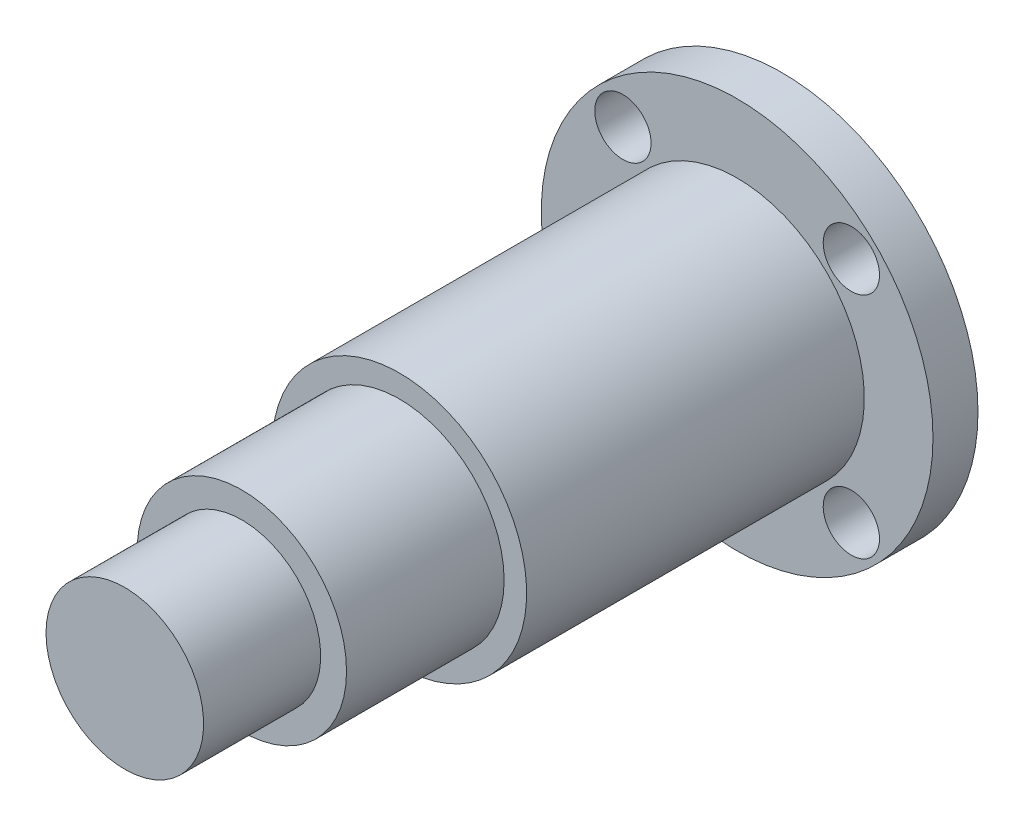
ISO-10303-21;
HEADER;
FILE_DESCRIPTION(('STEP AP214'),'2;1');
FILE_NAME('part.step','',(''),(''),'','','');
FILE_SCHEMA(('AUTOMOTIVE_DESIGN { 1 0 10303 214 1 1 1 1 }'));
ENDSEC;
DATA;
#1=APPLICATION_CONTEXT('core data for automotive mechanical design processes');
#2=APPLICATION_PROTOCOL_DEFINITION('international standard','automotive_design',2000,#1);
#3=PRODUCT_CONTEXT('',#1,'mechanical');
#4=PRODUCT('Part','Part','',(#3));
#5=PRODUCT_RELATED_PRODUCT_CATEGORY('part','',(#4));
#6=PRODUCT_DEFINITION_FORMATION('','',#4);
#7=PRODUCT_DEFINITION_CONTEXT('part definition',#1,'design');
#8=PRODUCT_DEFINITION('design','',#6,#7);
#9=PRODUCT_DEFINITION_SHAPE('','',#8);
#10=(LENGTH_UNIT() NAMED_UNIT(*) SI_UNIT(.MILLI.,.METRE.));
#11=(NAMED_UNIT(*) PLANE_ANGLE_UNIT() SI_UNIT($,.RADIAN.));
#12=(NAMED_UNIT(*) SI_UNIT($,.STERADIAN.) SOLID_ANGLE_UNIT());
#13=UNCERTAINTY_MEASURE_WITH_UNIT(LENGTH_MEASURE(1.E-05),#10,'distance_accuracy_value','');
#14=(GEOMETRIC_REPRESENTATION_CONTEXT(3) GLOBAL_UNCERTAINTY_ASSIGNED_CONTEXT((#13)) GLOBAL_UNIT_ASSIGNED_CONTEXT((#10,
#11,#12)) REPRESENTATION_CONTEXT('',''));
#15=CARTESIAN_POINT('',(0.,0.,0.));
#16=DIRECTION('',(0.,0.,1.));
#17=DIRECTION('',(1.,0.,0.));
#18=AXIS2_PLACEMENT_3D('',#15,#16,#17);
#19=CARTESIAN_POINT('',(0.,0.,5.08));
#20=DIRECTION('',(0.,0.,-1.));
#21=DIRECTION('',(-1.,0.,0.));
#22=AXIS2_PLACEMENT_3D('',#19,#20,#21);
#23=CYLINDRICAL_SURFACE('',#22,22.098);
#24=CARTESIAN_POINT('',(0.,0.,5.08));
#25=DIRECTION('',(0.,0.,1.));
#26=DIRECTION('',(1.,0.,0.));
#27=AXIS2_PLACEMENT_3D('',#24,#25,#26);
#28=CIRCLE('',#27,22.098);
#29=CARTESIAN_POINT('',(22.098,0.,5.08));
#30=VERTEX_POINT('',#29);
#31=EDGE_CURVE('E73',#30,#30,#28,.T.);
#32=ORIENTED_EDGE('',*,*,#31,.F.);
#33=EDGE_LOOP('',(#32));
#34=FACE_BOUND('',#33,.T.);
#35=CARTESIAN_POINT('',(0.,0.,0.));
#36=DIRECTION('',(0.,0.,1.));
#37=DIRECTION('',(1.,0.,0.));
#38=AXIS2_PLACEMENT_3D('',#35,#36,#37);
#39=CIRCLE('',#38,22.098);
#40=CARTESIAN_POINT('',(22.098,0.,0.));
#41=VERTEX_POINT('',#40);
#42=EDGE_CURVE('E46',#41,#41,#39,.T.);
#43=ORIENTED_EDGE('',*,*,#42,.T.);
#44=EDGE_LOOP('',(#43));
#45=FACE_BOUND('',#44,.T.);
#46=ADVANCED_FACE('F43',(#34,#45),#23,.T.);
#47=CARTESIAN_POINT('',(0.,0.,5.08));
#48=DIRECTION('',(0.,0.,1.));
#49=DIRECTION('',(1.,0.,0.));
#50=AXIS2_PLACEMENT_3D('',#47,#48,#49);
#51=PLANE('',#50);
#52=CARTESIAN_POINT('',(-12.8866675337343,12.8866675337342,5.08));
#53=DIRECTION('',(0.,0.,1.));
#54=DIRECTION('',(1.,0.,0.));
#55=AXIS2_PLACEMENT_3D('',#52,#53,#54);
#56=CIRCLE('',#55,3.175);
#57=CARTESIAN_POINT('',(-9.71166753373426,12.8866675337342,5.08));
#58=VERTEX_POINT('',#57);
#59=EDGE_CURVE('E216',#58,#58,#56,.F.);
#60=ORIENTED_EDGE('',*,*,#59,.T.);
#61=EDGE_LOOP('',(#60));
#62=FACE_BOUND('',#61,.T.);
#63=CARTESIAN_POINT('',(-12.8866675337343,-12.8866675337342,5.08));
#64=DIRECTION('',(0.,0.,1.));
#65=DIRECTION('',(1.,0.,0.));
#66=AXIS2_PLACEMENT_3D('',#63,#64,#65);
#67=CIRCLE('',#66,3.175);
#68=CARTESIAN_POINT('',(-9.71166753373426,-12.8866675337342,5.08));
#69=VERTEX_POINT('',#68);
#70=EDGE_CURVE('E225',#69,#69,#67,.F.);
#71=ORIENTED_EDGE('',*,*,#70,.T.);
#72=EDGE_LOOP('',(#71));
#73=FACE_BOUND('',#72,.T.);
#74=CARTESIAN_POINT('',(12.8866675337343,-12.8866675337341,5.08));
#75=DIRECTION('',(0.,0.,1.));
#76=DIRECTION('',(1.,0.,0.));
#77=AXIS2_PLACEMENT_3D('',#74,#75,#76);
#78=CIRCLE('',#77,3.175);
#79=CARTESIAN_POINT('',(16.0616675337343,-12.8866675337341,5.08));
#80=VERTEX_POINT('',#79);
#81=EDGE_CURVE('E232',#80,#80,#78,.F.);
#82=ORIENTED_EDGE('',*,*,#81,.T.);
#83=EDGE_LOOP('',(#82));
#84=FACE_BOUND('',#83,.T.);
#85=CARTESIAN_POINT('',(12.8866675337343,12.8866675337342,5.08));
#86=DIRECTION('',(0.,0.,1.));
#87=DIRECTION('',(1.,0.,0.));
#88=AXIS2_PLACEMENT_3D('',#85,#86,#87);
#89=CIRCLE('',#88,3.175);
#90=CARTESIAN_POINT('',(16.0616675337343,12.8866675337342,5.08));
#91=VERTEX_POINT('',#90);
#92=EDGE_CURVE('E223',#91,#91,#89,.F.);
#93=ORIENTED_EDGE('',*,*,#92,.T.);
#94=EDGE_LOOP('',(#93));
#95=FACE_BOUND('',#94,.T.);
#96=CARTESIAN_POINT('',(0.,0.,5.08));
#97=DIRECTION('',(0.,0.,1.));
#98=DIRECTION('',(1.,0.,0.));
#99=AXIS2_PLACEMENT_3D('',#96,#97,#98);
#100=CIRCLE('',#99,14.351);
#101=CARTESIAN_POINT('',(-14.351,0.,5.08));
#102=VERTEX_POINT('',#101);
#103=EDGE_CURVE('E57',#102,#102,#100,.T.);
#104=ORIENTED_EDGE('',*,*,#103,.F.);
#105=EDGE_LOOP('',(#104));
#106=FACE_BOUND('',#105,.T.);
#107=ORIENTED_EDGE('',*,*,#31,.T.);
#108=EDGE_LOOP('',(#107));
#109=FACE_BOUND('',#108,.T.);
#110=ADVANCED_FACE('F86',(#62,#73,#84,#95,#106,#109),#51,.T.);
#111=CARTESIAN_POINT('',(0.,0.,0.));
#112=DIRECTION('',(0.,0.,1.));
#113=DIRECTION('',(1.,0.,0.));
#114=AXIS2_PLACEMENT_3D('',#111,#112,#113);
#115=PLANE('',#114);
#116=CARTESIAN_POINT('',(-12.8866675337343,12.8866675337342,0.));
#117=DIRECTION('',(0.,0.,-1.));
#118=DIRECTION('',(0.,-1.,0.));
#119=AXIS2_PLACEMENT_3D('',#116,#117,#118);
#120=CIRCLE('',#119,3.175);
#121=CARTESIAN_POINT('',(-12.8866675337342,9.71166753373421,0.));
#122=VERTEX_POINT('',#121);
#123=EDGE_CURVE('E213',#122,#122,#120,.T.);
#124=ORIENTED_EDGE('',*,*,#123,.F.);
#125=EDGE_LOOP('',(#124));
#126=FACE_BOUND('',#125,.T.);
#127=CARTESIAN_POINT('',(-12.8866675337343,-12.8866675337342,0.));
#128=DIRECTION('',(0.,0.,-1.));
#129=DIRECTION('',(1.,0.,0.));
#130=AXIS2_PLACEMENT_3D('',#127,#128,#129);
#131=CIRCLE('',#130,3.175);
#132=CARTESIAN_POINT('',(-9.71166753373426,-12.8866675337342,0.));
#133=VERTEX_POINT('',#132);
#134=EDGE_CURVE('E228',#133,#133,#131,.T.);
#135=ORIENTED_EDGE('',*,*,#134,.F.);
#136=EDGE_LOOP('',(#135));
#137=FACE_BOUND('',#136,.T.);
#138=CARTESIAN_POINT('',(12.8866675337343,-12.8866675337341,0.));
#139=DIRECTION('',(0.,0.,-1.));
#140=DIRECTION('',(0.,1.,0.));
#141=AXIS2_PLACEMENT_3D('',#138,#139,#140);
#142=CIRCLE('',#141,3.175);
#143=CARTESIAN_POINT('',(12.8866675337343,-9.71166753373412,0.));
#144=VERTEX_POINT('',#143);
#145=EDGE_CURVE('E236',#144,#144,#142,.T.);
#146=ORIENTED_EDGE('',*,*,#145,.F.);
#147=EDGE_LOOP('',(#146));
#148=FACE_BOUND('',#147,.T.);
#149=CARTESIAN_POINT('',(12.8866675337343,12.8866675337342,0.));
#150=DIRECTION('',(0.,0.,-1.));
#151=DIRECTION('',(-1.,0.,0.));
#152=AXIS2_PLACEMENT_3D('',#149,#150,#151);
#153=CIRCLE('',#152,3.175);
#154=CARTESIAN_POINT('',(9.71166753373426,12.8866675337342,0.));
#155=VERTEX_POINT('',#154);
#156=EDGE_CURVE('E218',#155,#155,#153,.T.);
#157=ORIENTED_EDGE('',*,*,#156,.F.);
#158=EDGE_LOOP('',(#157));
#159=FACE_BOUND('',#158,.T.);
#160=ORIENTED_EDGE('',*,*,#42,.F.);
#161=EDGE_LOOP('',(#160));
#162=FACE_BOUND('',#161,.T.);
#163=ADVANCED_FACE('F83',(#126,#137,#148,#159,#162),#115,.F.);
#164=CARTESIAN_POINT('',(0.,0.,43.18));
#165=DIRECTION('',(0.,0.,-1.));
#166=DIRECTION('',(-1.,0.,0.));
#167=AXIS2_PLACEMENT_3D('',#164,#165,#166);
#168=CYLINDRICAL_SURFACE('',#167,14.351);
#169=CARTESIAN_POINT('',(0.,0.,43.18));
#170=DIRECTION('',(0.,0.,1.));
#171=DIRECTION('',(1.,0.,0.));
#172=AXIS2_PLACEMENT_3D('',#169,#170,#171);
#173=CIRCLE('',#172,14.351);
#174=CARTESIAN_POINT('',(-14.351,0.,43.18));
#175=VERTEX_POINT('',#174);
#176=EDGE_CURVE('E66',#175,#175,#173,.T.);
#177=CARTESIAN_POINT('',(-14.351,0.,43.18));
#178=CARTESIAN_POINT('',(-14.351,0.,42.783125));
#179=CARTESIAN_POINT('',(-14.351,0.,42.38625));
#180=CARTESIAN_POINT('',(-14.351,0.,41.5925));
#181=CARTESIAN_POINT('',(-14.351,0.,41.195625));
#182=CARTESIAN_POINT('',(-14.351,0.,40.401875));
#183=CARTESIAN_POINT('',(-14.351,0.,40.005));
#184=CARTESIAN_POINT('',(-14.351,0.,39.21125));
#185=CARTESIAN_POINT('',(-14.351,0.,38.814375));
#186=CARTESIAN_POINT('',(-14.351,0.,38.020625));
#187=CARTESIAN_POINT('',(-14.351,0.,37.62375));
#188=CARTESIAN_POINT('',(-14.351,0.,36.83));
#189=CARTESIAN_POINT('',(-14.351,0.,36.433125));
#190=CARTESIAN_POINT('',(-14.351,0.,35.639375));
#191=CARTESIAN_POINT('',(-14.351,0.,35.2425));
#192=CARTESIAN_POINT('',(-14.351,0.,34.44875));
#193=CARTESIAN_POINT('',(-14.351,0.,34.051875));
#194=CARTESIAN_POINT('',(-14.351,0.,33.258125));
#195=CARTESIAN_POINT('',(-14.351,0.,32.86125));
#196=CARTESIAN_POINT('',(-14.351,0.,32.0675));
#197=CARTESIAN_POINT('',(-14.351,0.,31.670625));
#198=CARTESIAN_POINT('',(-14.351,0.,30.876875));
#199=CARTESIAN_POINT('',(-14.351,0.,30.48));
#200=CARTESIAN_POINT('',(-14.351,0.,29.68625));
#201=CARTESIAN_POINT('',(-14.351,0.,29.289375));
#202=CARTESIAN_POINT('',(-14.351,0.,28.495625));
#203=CARTESIAN_POINT('',(-14.351,0.,28.09875));
#204=CARTESIAN_POINT('',(-14.351,0.,27.305));
#205=CARTESIAN_POINT('',(-14.351,0.,26.908125));
#206=CARTESIAN_POINT('',(-14.351,0.,26.114375));
#207=CARTESIAN_POINT('',(-14.351,0.,25.7175));
#208=CARTESIAN_POINT('',(-14.351,0.,24.92375));
#209=CARTESIAN_POINT('',(-14.351,0.,24.526875));
#210=CARTESIAN_POINT('',(-14.351,0.,23.733125));
#211=CARTESIAN_POINT('',(-14.351,0.,23.33625));
#212=CARTESIAN_POINT('',(-14.351,0.,22.5425));
#213=CARTESIAN_POINT('',(-14.351,0.,22.145625));
#214=CARTESIAN_POINT('',(-14.351,0.,21.351875));
#215=CARTESIAN_POINT('',(-14.351,0.,20.955));
#216=CARTESIAN_POINT('',(-14.351,0.,20.16125));
#217=CARTESIAN_POINT('',(-14.351,0.,19.764375));
#218=CARTESIAN_POINT('',(-14.351,0.,18.970625));
#219=CARTESIAN_POINT('',(-14.351,0.,18.57375));
#220=CARTESIAN_POINT('',(-14.351,0.,17.78));
#221=CARTESIAN_POINT('',(-14.351,0.,17.383125));
#222=CARTESIAN_POINT('',(-14.351,0.,16.589375));
#223=CARTESIAN_POINT('',(-14.351,0.,16.1925));
#224=CARTESIAN_POINT('',(-14.351,0.,15.39875));
#225=CARTESIAN_POINT('',(-14.351,0.,15.001875));
#226=CARTESIAN_POINT('',(-14.351,0.,14.208125));
#227=CARTESIAN_POINT('',(-14.351,0.,13.81125));
#228=CARTESIAN_POINT('',(-14.351,0.,13.0175));
#229=CARTESIAN_POINT('',(-14.351,0.,12.620625));
#230=CARTESIAN_POINT('',(-14.351,0.,11.826875));
#231=CARTESIAN_POINT('',(-14.351,0.,11.43));
#232=CARTESIAN_POINT('',(-14.351,0.,10.63625));
#233=CARTESIAN_POINT('',(-14.351,0.,10.239375));
#234=CARTESIAN_POINT('',(-14.351,0.,9.44562500000001));
#235=CARTESIAN_POINT('',(-14.351,0.,9.04875));
#236=CARTESIAN_POINT('',(-14.351,0.,8.255));
#237=CARTESIAN_POINT('',(-14.351,0.,7.858125));
#238=CARTESIAN_POINT('',(-14.351,0.,7.064375));
#239=CARTESIAN_POINT('',(-14.351,0.,6.6675));
#240=CARTESIAN_POINT('',(-14.351,0.,5.87375));
#241=CARTESIAN_POINT('',(-14.351,0.,5.476875));
#242=CARTESIAN_POINT('',(-14.351,0.,5.08));
#243=B_SPLINE_CURVE_WITH_KNOTS('',3,(#177,#178,#179,#180,#181,#182,#183,#184,#185,#186,#187,
#188,#189,#190,#191,#192,#193,#194,#195,#196,#197,#198,#199,#200,#201,#202,#203,#204,#205,#206,
#207,#208,#209,#210,#211,#212,#213,#214,#215,#216,#217,#218,#219,#220,#221,#222,#223,#224,#225,
#226,#227,#228,#229,#230,#231,#232,#233,#234,#235,#236,#237,#238,#239,#240,#241,#242),
.UNSPECIFIED.,.F.,.F.,(4,2,2,2,2,2,2,2,2,2,2,2,2,2,2,2,2,2,2,2,2,2,2,2,2,2,2,2,2,2,2,2,4),(0.,
1.190625,2.38125,3.571875,4.7625,5.953125,7.14375,8.334375,9.52500000000001,10.715625,11.90625,
13.096875,14.2875,15.478125,16.66875,17.859375,19.05,20.240625,21.43125,22.621875,23.8125,
25.003125,26.19375,27.384375,28.575,29.765625,30.95625,32.146875,33.3375,34.528125,35.71875,
36.909375,38.1),.UNSPECIFIED.);
#244=EDGE_CURVE('BSEAM85',#175,#102,#243,.T.);
#245=ORIENTED_EDGE('',*,*,#176,.F.);
#246=ORIENTED_EDGE('',*,*,#103,.T.);
#247=ORIENTED_EDGE('',*,*,#244,.T.);
#248=ORIENTED_EDGE('',*,*,#244,.F.);
#249=EDGE_LOOP('',(#245,#247,#246,#248));
#250=FACE_BOUND('',#249,.T.);
#251=ADVANCED_FACE('F85',(#250),#168,.T.);
#252=CARTESIAN_POINT('',(0.,0.,43.18));
#253=DIRECTION('',(0.,0.,1.));
#254=DIRECTION('',(1.,0.,0.));
#255=AXIS2_PLACEMENT_3D('',#252,#253,#254);
#256=PLANE('',#255);
#257=CARTESIAN_POINT('',(0.,0.,43.18));
#258=DIRECTION('',(0.,0.,1.));
#259=DIRECTION('',(1.,0.,0.));
#260=AXIS2_PLACEMENT_3D('',#257,#258,#259);
#261=CIRCLE('',#260,11.811);
#262=CARTESIAN_POINT('',(11.811,0.,43.18));
#263=VERTEX_POINT('',#262);
#264=EDGE_CURVE('E51',#263,#263,#261,.T.);
#265=ORIENTED_EDGE('',*,*,#264,.F.);
#266=EDGE_LOOP('',(#265));
#267=FACE_BOUND('',#266,.T.);
#268=ORIENTED_EDGE('',*,*,#176,.T.);
#269=EDGE_LOOP('',(#268));
#270=FACE_BOUND('',#269,.T.);
#271=ADVANCED_FACE('F93',(#267,#270),#256,.T.);
#272=CARTESIAN_POINT('',(0.,0.,60.96));
#273=DIRECTION('',(0.,0.,-1.));
#274=DIRECTION('',(-1.,0.,0.));
#275=AXIS2_PLACEMENT_3D('',#272,#273,#274);
#276=CYLINDRICAL_SURFACE('',#275,11.811);
#277=CARTESIAN_POINT('',(0.,0.,60.96));
#278=DIRECTION('',(0.,0.,1.));
#279=DIRECTION('',(1.,0.,0.));
#280=AXIS2_PLACEMENT_3D('',#277,#278,#279);
#281=CIRCLE('',#280,11.811);
#282=CARTESIAN_POINT('',(11.811,0.,60.96));
#283=VERTEX_POINT('',#282);
#284=EDGE_CURVE('E63',#283,#283,#281,.T.);
#285=ORIENTED_EDGE('',*,*,#284,.F.);
#286=EDGE_LOOP('',(#285));
#287=FACE_BOUND('',#286,.T.);
#288=ORIENTED_EDGE('',*,*,#264,.T.);
#289=EDGE_LOOP('',(#288));
#290=FACE_BOUND('',#289,.T.);
#291=ADVANCED_FACE('F117',(#287,#290),#276,.T.);
#292=CARTESIAN_POINT('',(0.,0.,60.96));
#293=DIRECTION('',(0.,0.,1.));
#294=DIRECTION('',(1.,0.,0.));
#295=AXIS2_PLACEMENT_3D('',#292,#293,#294);
#296=PLANE('',#295);
#297=CARTESIAN_POINT('',(0.,0.,60.96));
#298=DIRECTION('',(0.,0.,1.));
#299=DIRECTION('',(1.,0.,0.));
#300=AXIS2_PLACEMENT_3D('',#297,#298,#299);
#301=CIRCLE('',#300,8.89);
#302=CARTESIAN_POINT('',(-8.89,0.,60.96));
#303=VERTEX_POINT('',#302);
#304=EDGE_CURVE('E10',#303,#303,#301,.T.);
#305=ORIENTED_EDGE('',*,*,#304,.F.);
#306=EDGE_LOOP('',(#305));
#307=FACE_BOUND('',#306,.T.);
#308=ORIENTED_EDGE('',*,*,#284,.T.);
#309=EDGE_LOOP('',(#308));
#310=FACE_BOUND('',#309,.T.);
#311=ADVANCED_FACE('F126',(#307,#310),#296,.T.);
#312=CARTESIAN_POINT('',(0.,0.,74.168));
#313=DIRECTION('',(0.,0.,-1.));
#314=DIRECTION('',(-1.,0.,0.));
#315=AXIS2_PLACEMENT_3D('',#312,#313,#314);
#316=CYLINDRICAL_SURFACE('',#315,8.89);
#317=CARTESIAN_POINT('',(0.,0.,74.168));
#318=DIRECTION('',(0.,0.,1.));
#319=DIRECTION('',(1.,0.,0.));
#320=AXIS2_PLACEMENT_3D('',#317,#318,#319);
#321=CIRCLE('',#320,8.89);
#322=CARTESIAN_POINT('',(-8.89,0.,74.168));
#323=VERTEX_POINT('',#322);
#324=EDGE_CURVE('E61',#323,#323,#321,.T.);
#325=CARTESIAN_POINT('',(-8.89,0.,74.168));
#326=CARTESIAN_POINT('',(-8.89,0.,74.0304166666667));
#327=CARTESIAN_POINT('',(-8.89,0.,73.8928333333333));
#328=CARTESIAN_POINT('',(-8.89,0.,73.6176666666667));
#329=CARTESIAN_POINT('',(-8.89,0.,73.4800833333333));
#330=CARTESIAN_POINT('',(-8.89,0.,73.2049166666667));
#331=CARTESIAN_POINT('',(-8.89,0.,73.0673333333333));
#332=CARTESIAN_POINT('',(-8.89,0.,72.7921666666667));
#333=CARTESIAN_POINT('',(-8.89,0.,72.6545833333333));
#334=CARTESIAN_POINT('',(-8.89,0.,72.3794166666667));
#335=CARTESIAN_POINT('',(-8.89,0.,72.2418333333333));
#336=CARTESIAN_POINT('',(-8.89,0.,71.9666666666667));
#337=CARTESIAN_POINT('',(-8.89,0.,71.8290833333333));
#338=CARTESIAN_POINT('',(-8.89,0.,71.5539166666667));
#339=CARTESIAN_POINT('',(-8.89,0.,71.4163333333333));
#340=CARTESIAN_POINT('',(-8.89,0.,71.1411666666667));
#341=CARTESIAN_POINT('',(-8.89,0.,71.0035833333333));
#342=CARTESIAN_POINT('',(-8.89,0.,70.7284166666667));
#343=CARTESIAN_POINT('',(-8.89,0.,70.5908333333333));
#344=CARTESIAN_POINT('',(-8.89,0.,70.3156666666667));
#345=CARTESIAN_POINT('',(-8.89,0.,70.1780833333333));
#346=CARTESIAN_POINT('',(-8.89,0.,69.9029166666667));
#347=CARTESIAN_POINT('',(-8.89,0.,69.7653333333333));
#348=CARTESIAN_POINT('',(-8.89,0.,69.4901666666667));
#349=CARTESIAN_POINT('',(-8.89,0.,69.3525833333333));
#350=CARTESIAN_POINT('',(-8.89,0.,69.0774166666667));
#351=CARTESIAN_POINT('',(-8.89,0.,68.9398333333333));
#352=CARTESIAN_POINT('',(-8.89,0.,68.6646666666667));
#353=CARTESIAN_POINT('',(-8.89,0.,68.5270833333333));
#354=CARTESIAN_POINT('',(-8.89,0.,68.2519166666667));
#355=CARTESIAN_POINT('',(-8.89,0.,68.1143333333333));
#356=CARTESIAN_POINT('',(-8.89,0.,67.8391666666667));
#357=CARTESIAN_POINT('',(-8.89,0.,67.7015833333333));
#358=CARTESIAN_POINT('',(-8.89,0.,67.4264166666667));
#359=CARTESIAN_POINT('',(-8.89,0.,67.2888333333333));
#360=CARTESIAN_POINT('',(-8.89,0.,67.0136666666667));
#361=CARTESIAN_POINT('',(-8.89,0.,66.8760833333333));
#362=CARTESIAN_POINT('',(-8.89,0.,66.6009166666667));
#363=CARTESIAN_POINT('',(-8.89,0.,66.4633333333333));
#364=CARTESIAN_POINT('',(-8.89,0.,66.1881666666667));
#365=CARTESIAN_POINT('',(-8.89,0.,66.0505833333333));
#366=CARTESIAN_POINT('',(-8.89,0.,65.7754166666667));
#367=CARTESIAN_POINT('',(-8.89,0.,65.6378333333333));
#368=CARTESIAN_POINT('',(-8.89,0.,65.3626666666667));
#369=CARTESIAN_POINT('',(-8.89,0.,65.2250833333333));
#370=CARTESIAN_POINT('',(-8.89,0.,64.9499166666667));
#371=CARTESIAN_POINT('',(-8.89,0.,64.8123333333333));
#372=CARTESIAN_POINT('',(-8.89,0.,64.5371666666667));
#373=CARTESIAN_POINT('',(-8.89,0.,64.3995833333333));
#374=CARTESIAN_POINT('',(-8.89,0.,64.1244166666667));
#375=CARTESIAN_POINT('',(-8.89,0.,63.9868333333333));
#376=CARTESIAN_POINT('',(-8.89,0.,63.7116666666667));
#377=CARTESIAN_POINT('',(-8.89,0.,63.5740833333333));
#378=CARTESIAN_POINT('',(-8.89,0.,63.2989166666667));
#379=CARTESIAN_POINT('',(-8.89,0.,63.1613333333333));
#380=CARTESIAN_POINT('',(-8.89,0.,62.8861666666667));
#381=CARTESIAN_POINT('',(-8.89,0.,62.7485833333333));
#382=CARTESIAN_POINT('',(-8.89,0.,62.4734166666667));
#383=CARTESIAN_POINT('',(-8.89,0.,62.3358333333333));
#384=CARTESIAN_POINT('',(-8.89,0.,62.0606666666667));
#385=CARTESIAN_POINT('',(-8.89,0.,61.9230833333333));
#386=CARTESIAN_POINT('',(-8.89,0.,61.6479166666667));
#387=CARTESIAN_POINT('',(-8.89,0.,61.5103333333333));
#388=CARTESIAN_POINT('',(-8.89,0.,61.2351666666667));
#389=CARTESIAN_POINT('',(-8.89,0.,61.0975833333333));
#390=CARTESIAN_POINT('',(-8.89,0.,60.96));
#391=B_SPLINE_CURVE_WITH_KNOTS('',3,(#325,#326,#327,#328,#329,#330,#331,#332,#333,#334,#335,
#336,#337,#338,#339,#340,#341,#342,#343,#344,#345,#346,#347,#348,#349,#350,#351,#352,#353,#354,
#355,#356,#357,#358,#359,#360,#361,#362,#363,#364,#365,#366,#367,#368,#369,#370,#371,#372,#373,
#374,#375,#376,#377,#378,#379,#380,#381,#382,#383,#384,#385,#386,#387,#388,#389,#390),
.UNSPECIFIED.,.F.,.F.,(4,2,2,2,2,2,2,2,2,2,2,2,2,2,2,2,2,2,2,2,2,2,2,2,2,2,2,2,2,2,2,2,4),(0.,
0.412750000000003,0.825500000000007,1.23825000000001,1.651,2.06375,2.47650000000001,
2.88925000000001,3.302,3.71475,4.12750000000001,4.54025000000001,4.953,5.36575,5.77850000000001,
6.19125000000001,6.604,7.01675,7.42950000000001,7.84225000000001,8.255,8.66775,9.08050000000001,
9.49325000000001,9.906,10.31875,10.7315,11.14425,11.557,11.96975,12.3825,12.79525,13.208),.UNSPECIFIED.);
#392=EDGE_CURVE('BSEAM135',#323,#303,#391,.T.);
#393=ORIENTED_EDGE('',*,*,#324,.F.);
#394=ORIENTED_EDGE('',*,*,#304,.T.);
#395=ORIENTED_EDGE('',*,*,#392,.T.);
#396=ORIENTED_EDGE('',*,*,#392,.F.);
#397=EDGE_LOOP('',(#393,#395,#394,#396));
#398=FACE_BOUND('',#397,.T.);
#399=ADVANCED_FACE('F135',(#398),#316,.T.);
#400=CARTESIAN_POINT('',(0.,0.,74.168));
#401=DIRECTION('',(0.,0.,1.));
#402=DIRECTION('',(1.,0.,0.));
#403=AXIS2_PLACEMENT_3D('',#400,#401,#402);
#404=PLANE('',#403);
#405=ORIENTED_EDGE('',*,*,#324,.T.);
#406=EDGE_LOOP('',(#405));
#407=FACE_BOUND('',#406,.T.);
#408=ADVANCED_FACE('F144',(#407),#404,.T.);
#409=CARTESIAN_POINT('',(12.8866675337343,12.8866675337342,14.0602561210692));
#410=DIRECTION('',(0.,0.,-1.));
#411=DIRECTION('',(-1.,0.,0.));
#412=AXIS2_PLACEMENT_3D('',#409,#410,#411);
#413=CYLINDRICAL_SURFACE('',#412,3.175);
#414=ORIENTED_EDGE('',*,*,#156,.T.);
#415=EDGE_LOOP('',(#414));
#416=FACE_BOUND('',#415,.T.);
#417=ORIENTED_EDGE('',*,*,#92,.F.);
#418=EDGE_LOOP('',(#417));
#419=FACE_BOUND('',#418,.T.);
#420=ADVANCED_FACE('F153',(#416,#419),#413,.F.);
#421=CARTESIAN_POINT('',(12.8866675337343,-12.8866675337341,14.0602561210692));
#422=DIRECTION('',(0.,0.,-1.));
#423=DIRECTION('',(-1.,0.,0.));
#424=AXIS2_PLACEMENT_3D('',#421,#422,#423);
#425=CYLINDRICAL_SURFACE('',#424,3.175);
#426=ORIENTED_EDGE('',*,*,#145,.T.);
#427=EDGE_LOOP('',(#426));
#428=FACE_BOUND('',#427,.T.);
#429=ORIENTED_EDGE('',*,*,#81,.F.);
#430=EDGE_LOOP('',(#429));
#431=FACE_BOUND('',#430,.T.);
#432=ADVANCED_FACE('F161',(#428,#431),#425,.F.);
#433=CARTESIAN_POINT('',(-12.8866675337343,-12.8866675337342,14.0602561210692));
#434=DIRECTION('',(0.,0.,-1.));
#435=DIRECTION('',(-1.,0.,0.));
#436=AXIS2_PLACEMENT_3D('',#433,#434,#435);
#437=CYLINDRICAL_SURFACE('',#436,3.175);
#438=ORIENTED_EDGE('',*,*,#134,.T.);
#439=EDGE_LOOP('',(#438));
#440=FACE_BOUND('',#439,.T.);
#441=ORIENTED_EDGE('',*,*,#70,.F.);
#442=EDGE_LOOP('',(#441));
#443=FACE_BOUND('',#442,.T.);
#444=ADVANCED_FACE('F187',(#440,#443),#437,.F.);
#445=CARTESIAN_POINT('',(-12.8866675337343,12.8866675337342,14.0602561210692));
#446=DIRECTION('',(0.,0.,-1.));
#447=DIRECTION('',(-1.,0.,0.));
#448=AXIS2_PLACEMENT_3D('',#445,#446,#447);
#449=CYLINDRICAL_SURFACE('',#448,3.175);
#450=ORIENTED_EDGE('',*,*,#123,.T.);
#451=EDGE_LOOP('',(#450));
#452=FACE_BOUND('',#451,.T.);
#453=ORIENTED_EDGE('',*,*,#59,.F.);
#454=EDGE_LOOP('',(#453));
#455=FACE_BOUND('',#454,.T.);
#456=ADVANCED_FACE('F196',(#452,#455),#449,.F.);
#457=CLOSED_SHELL('',(#46,#110,#163,#251,#271,#291,#311,#399,#408,#420,#432,#444,#456));
#458=MANIFOLD_SOLID_BREP('B2',#457);
#459=ADVANCED_BREP_SHAPE_REPRESENTATION('',(#18,#458),#14);
#460=SHAPE_DEFINITION_REPRESENTATION(#9,#459);
ENDSEC;
END-ISO-10303-21;
